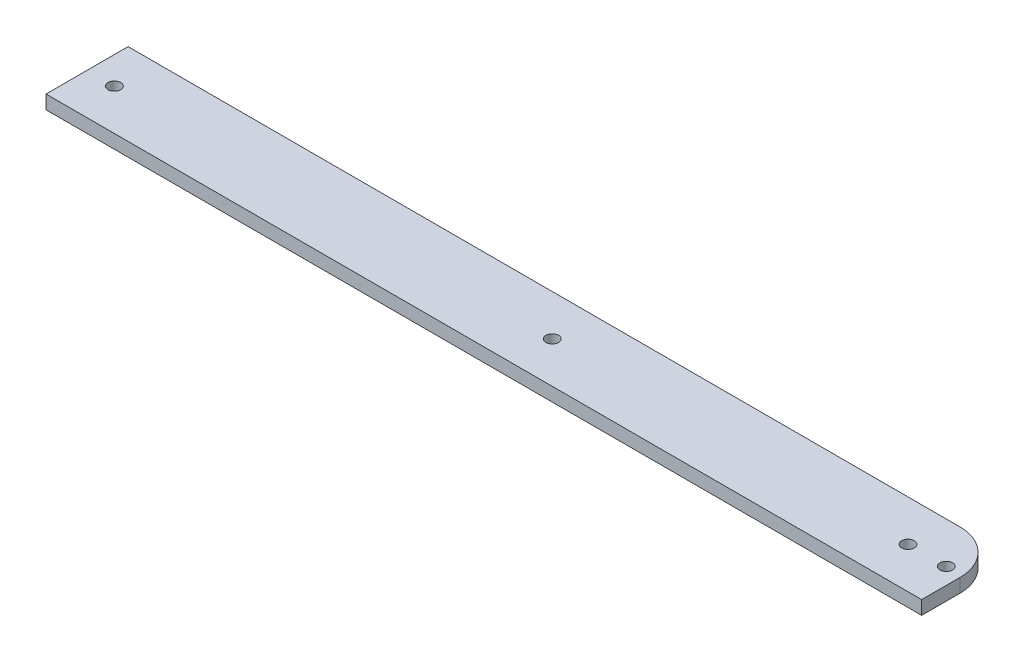
ISO-10303-21;
HEADER;
FILE_DESCRIPTION(('STEP AP214'),'2;1');
FILE_NAME('part.step','',(''),(''),'','','');
FILE_SCHEMA(('AUTOMOTIVE_DESIGN { 1 0 10303 214 1 1 1 1 }'));
ENDSEC;
DATA;
#1=APPLICATION_CONTEXT('core data for automotive mechanical design processes');
#2=APPLICATION_PROTOCOL_DEFINITION('international standard','automotive_design',2000,#1);
#3=PRODUCT_CONTEXT('',#1,'mechanical');
#4=PRODUCT('Part','Part','',(#3));
#5=PRODUCT_RELATED_PRODUCT_CATEGORY('part','',(#4));
#6=PRODUCT_DEFINITION_FORMATION('','',#4);
#7=PRODUCT_DEFINITION_CONTEXT('part definition',#1,'design');
#8=PRODUCT_DEFINITION('design','',#6,#7);
#9=PRODUCT_DEFINITION_SHAPE('','',#8);
#10=(LENGTH_UNIT() NAMED_UNIT(*) SI_UNIT(.MILLI.,.METRE.));
#11=(NAMED_UNIT(*) PLANE_ANGLE_UNIT() SI_UNIT($,.RADIAN.));
#12=(NAMED_UNIT(*) SI_UNIT($,.STERADIAN.) SOLID_ANGLE_UNIT());
#13=UNCERTAINTY_MEASURE_WITH_UNIT(LENGTH_MEASURE(1.E-05),#10,'distance_accuracy_value','');
#14=(GEOMETRIC_REPRESENTATION_CONTEXT(3) GLOBAL_UNCERTAINTY_ASSIGNED_CONTEXT((#13)) GLOBAL_UNIT_ASSIGNED_CONTEXT((#10,
#11,#12)) REPRESENTATION_CONTEXT('',''));
#15=CARTESIAN_POINT('',(0.,0.,0.));
#16=DIRECTION('',(0.,0.,1.));
#17=DIRECTION('',(1.,0.,0.));
#18=AXIS2_PLACEMENT_3D('',#15,#16,#17);
#19=CARTESIAN_POINT('',(0.,3.175,0.));
#20=DIRECTION('',(0.,-1.,0.));
#21=DIRECTION('',(0.,0.,-1.));
#22=AXIS2_PLACEMENT_3D('',#19,#20,#21);
#23=PLANE('',#22);
#24=CARTESIAN_POINT('',(199.39,3.175,-9.525));
#25=DIRECTION('',(0.,-1.,0.));
#26=DIRECTION('',(0.,0.,-1.));
#27=AXIS2_PLACEMENT_3D('',#24,#25,#26);
#28=CIRCLE('',#27,1.4605);
#29=CARTESIAN_POINT('',(199.39,3.175,-10.9855));
#30=VERTEX_POINT('',#29);
#31=EDGE_CURVE('E137',#30,#30,#28,.T.);
#32=ORIENTED_EDGE('',*,*,#31,.T.);
#33=EDGE_LOOP('',(#32));
#34=FACE_BOUND('',#33,.T.);
#35=CARTESIAN_POINT('',(190.5,3.175,-9.525));
#36=DIRECTION('',(0.,-1.,0.));
#37=DIRECTION('',(0.,0.,-1.));
#38=AXIS2_PLACEMENT_3D('',#35,#36,#37);
#39=CIRCLE('',#38,1.4605);
#40=CARTESIAN_POINT('',(190.5,3.175,-10.9855));
#41=VERTEX_POINT('',#40);
#42=EDGE_CURVE('E140',#41,#41,#39,.T.);
#43=ORIENTED_EDGE('',*,*,#42,.T.);
#44=EDGE_LOOP('',(#43));
#45=FACE_BOUND('',#44,.T.);
#46=DIRECTION('',(0.,0.,-1.));
#47=VECTOR('',#46,1.);
#48=CARTESIAN_POINT('',(203.2,3.175,0.));
#49=LINE('',#48,#47);
#50=CARTESIAN_POINT('',(203.2,3.175,0.));
#51=VERTEX_POINT('',#50);
#52=CARTESIAN_POINT('',(203.2,3.175,-8.89));
#53=VERTEX_POINT('',#52);
#54=EDGE_CURVE('E95',#51,#53,#49,.T.);
#55=ORIENTED_EDGE('',*,*,#54,.T.);
#56=CARTESIAN_POINT('',(193.04,3.175,-8.89));
#57=DIRECTION('',(0.,-1.,0.));
#58=DIRECTION('',(0.,0.,-1.));
#59=AXIS2_PLACEMENT_3D('',#56,#57,#58);
#60=CIRCLE('',#59,10.16);
#61=CARTESIAN_POINT('',(193.04,3.175,-19.05));
#62=VERTEX_POINT('',#61);
#63=EDGE_CURVE('E11',#53,#62,#60,.F.);
#64=ORIENTED_EDGE('',*,*,#63,.T.);
#65=DIRECTION('',(-1.,0.,0.));
#66=VECTOR('',#65,1.);
#67=CARTESIAN_POINT('',(0.,3.175,-19.05));
#68=LINE('',#67,#66);
#69=CARTESIAN_POINT('',(0.,3.175,-19.05));
#70=VERTEX_POINT('',#69);
#71=EDGE_CURVE('E101',#62,#70,#68,.T.);
#72=ORIENTED_EDGE('',*,*,#71,.T.);
#73=DIRECTION('',(0.,0.,1.));
#74=VECTOR('',#73,1.);
#75=CARTESIAN_POINT('',(0.,3.175,0.));
#76=LINE('',#75,#74);
#77=CARTESIAN_POINT('',(0.,3.175,0.));
#78=VERTEX_POINT('',#77);
#79=EDGE_CURVE('E96',#70,#78,#76,.T.);
#80=ORIENTED_EDGE('',*,*,#79,.T.);
#81=DIRECTION('',(1.,0.,0.));
#82=VECTOR('',#81,1.);
#83=CARTESIAN_POINT('',(0.,3.175,0.));
#84=LINE('',#83,#82);
#85=EDGE_CURVE('E86',#78,#51,#84,.T.);
#86=ORIENTED_EDGE('',*,*,#85,.T.);
#87=EDGE_LOOP('',(#55,#64,#72,#80,#86));
#88=FACE_BOUND('',#87,.T.);
#89=CARTESIAN_POINT('',(6.35,3.175,-9.525));
#90=DIRECTION('',(0.,1.,0.));
#91=DIRECTION('',(0.,0.,1.));
#92=AXIS2_PLACEMENT_3D('',#89,#90,#91);
#93=CIRCLE('',#92,1.4605);
#94=CARTESIAN_POINT('',(6.35,3.175,-8.0645));
#95=VERTEX_POINT('',#94);
#96=EDGE_CURVE('E125',#95,#95,#93,.T.);
#97=ORIENTED_EDGE('',*,*,#96,.F.);
#98=EDGE_LOOP('',(#97));
#99=FACE_BOUND('',#98,.T.);
#100=CARTESIAN_POINT('',(107.95,3.175,-9.525));
#101=DIRECTION('',(0.,1.,0.));
#102=DIRECTION('',(0.,0.,1.));
#103=AXIS2_PLACEMENT_3D('',#100,#101,#102);
#104=CIRCLE('',#103,1.4605);
#105=CARTESIAN_POINT('',(107.95,3.175,-8.0645));
#106=VERTEX_POINT('',#105);
#107=EDGE_CURVE('E131',#106,#106,#104,.T.);
#108=ORIENTED_EDGE('',*,*,#107,.F.);
#109=EDGE_LOOP('',(#108));
#110=FACE_BOUND('',#109,.T.);
#111=ADVANCED_FACE('F39',(#34,#45,#88,#99,#110),#23,.F.);
#112=CARTESIAN_POINT('',(0.,0.,0.));
#113=DIRECTION('',(0.,-1.,0.));
#114=DIRECTION('',(0.,0.,-1.));
#115=AXIS2_PLACEMENT_3D('',#112,#113,#114);
#116=PLANE('',#115);
#117=CARTESIAN_POINT('',(199.39,0.,-9.525));
#118=DIRECTION('',(0.,-1.,0.));
#119=DIRECTION('',(0.,0.,-1.));
#120=AXIS2_PLACEMENT_3D('',#117,#118,#119);
#121=CIRCLE('',#120,1.4605);
#122=CARTESIAN_POINT('',(199.39,0.,-10.9855));
#123=VERTEX_POINT('',#122);
#124=EDGE_CURVE('E146',#123,#123,#121,.T.);
#125=ORIENTED_EDGE('',*,*,#124,.F.);
#126=EDGE_LOOP('',(#125));
#127=FACE_BOUND('',#126,.T.);
#128=CARTESIAN_POINT('',(190.5,0.,-9.525));
#129=DIRECTION('',(0.,-1.,0.));
#130=DIRECTION('',(0.,0.,-1.));
#131=AXIS2_PLACEMENT_3D('',#128,#129,#130);
#132=CIRCLE('',#131,1.4605);
#133=CARTESIAN_POINT('',(190.5,0.,-10.9855));
#134=VERTEX_POINT('',#133);
#135=EDGE_CURVE('E143',#134,#134,#132,.T.);
#136=ORIENTED_EDGE('',*,*,#135,.F.);
#137=EDGE_LOOP('',(#136));
#138=FACE_BOUND('',#137,.T.);
#139=CARTESIAN_POINT('',(6.35,0.,-9.525));
#140=DIRECTION('',(0.,1.,0.));
#141=DIRECTION('',(0.,0.,1.));
#142=AXIS2_PLACEMENT_3D('',#139,#140,#141);
#143=CIRCLE('',#142,1.4605);
#144=CARTESIAN_POINT('',(6.35,0.,-8.0645));
#145=VERTEX_POINT('',#144);
#146=EDGE_CURVE('E128',#145,#145,#143,.T.);
#147=ORIENTED_EDGE('',*,*,#146,.T.);
#148=EDGE_LOOP('',(#147));
#149=FACE_BOUND('',#148,.T.);
#150=DIRECTION('',(-1.,0.,0.));
#151=VECTOR('',#150,1.);
#152=CARTESIAN_POINT('',(0.,0.,-19.05));
#153=LINE('',#152,#151);
#154=CARTESIAN_POINT('',(193.04,0.,-19.05));
#155=VERTEX_POINT('',#154);
#156=CARTESIAN_POINT('',(0.,0.,-19.05));
#157=VERTEX_POINT('',#156);
#158=EDGE_CURVE('E105',#155,#157,#153,.T.);
#159=ORIENTED_EDGE('',*,*,#158,.F.);
#160=CARTESIAN_POINT('',(193.04,0.,-8.89));
#161=DIRECTION('',(0.,-1.,0.));
#162=DIRECTION('',(0.,0.,-1.));
#163=AXIS2_PLACEMENT_3D('',#160,#161,#162);
#164=CIRCLE('',#163,10.16);
#165=CARTESIAN_POINT('',(203.2,0.,-8.89));
#166=VERTEX_POINT('',#165);
#167=EDGE_CURVE('E61',#155,#166,#164,.T.);
#168=ORIENTED_EDGE('',*,*,#167,.T.);
#169=DIRECTION('',(0.,0.,-1.));
#170=VECTOR('',#169,1.);
#171=CARTESIAN_POINT('',(203.2,0.,0.));
#172=LINE('',#171,#170);
#173=CARTESIAN_POINT('',(203.2,0.,0.));
#174=VERTEX_POINT('',#173);
#175=EDGE_CURVE('E120',#174,#166,#172,.T.);
#176=ORIENTED_EDGE('',*,*,#175,.F.);
#177=DIRECTION('',(1.,0.,0.));
#178=VECTOR('',#177,1.);
#179=CARTESIAN_POINT('',(0.,0.,0.));
#180=LINE('',#179,#178);
#181=CARTESIAN_POINT('',(0.,0.,0.));
#182=VERTEX_POINT('',#181);
#183=EDGE_CURVE('E122',#182,#174,#180,.T.);
#184=ORIENTED_EDGE('',*,*,#183,.F.);
#185=DIRECTION('',(0.,0.,1.));
#186=VECTOR('',#185,1.);
#187=CARTESIAN_POINT('',(0.,0.,0.));
#188=LINE('',#187,#186);
#189=EDGE_CURVE('E109',#157,#182,#188,.T.);
#190=ORIENTED_EDGE('',*,*,#189,.F.);
#191=EDGE_LOOP('',(#159,#168,#176,#184,#190));
#192=FACE_BOUND('',#191,.T.);
#193=CARTESIAN_POINT('',(107.95,0.,-9.525));
#194=DIRECTION('',(0.,1.,0.));
#195=DIRECTION('',(0.,0.,1.));
#196=AXIS2_PLACEMENT_3D('',#193,#194,#195);
#197=CIRCLE('',#196,1.4605);
#198=CARTESIAN_POINT('',(107.95,0.,-8.0645));
#199=VERTEX_POINT('',#198);
#200=EDGE_CURVE('E134',#199,#199,#197,.T.);
#201=ORIENTED_EDGE('',*,*,#200,.T.);
#202=EDGE_LOOP('',(#201));
#203=FACE_BOUND('',#202,.T.);
#204=ADVANCED_FACE('F161',(#127,#138,#149,#192,#203),#116,.T.);
#205=CARTESIAN_POINT('',(0.,3.175,0.));
#206=DIRECTION('',(1.,0.,0.));
#207=DIRECTION('',(0.,0.,-1.));
#208=AXIS2_PLACEMENT_3D('',#205,#206,#207);
#209=PLANE('',#208);
#210=ORIENTED_EDGE('',*,*,#189,.T.);
#211=DIRECTION('',(0.,-1.,0.));
#212=VECTOR('',#211,1.);
#213=CARTESIAN_POINT('',(0.,3.175,0.));
#214=LINE('',#213,#212);
#215=EDGE_CURVE('E90',#78,#182,#214,.T.);
#216=ORIENTED_EDGE('',*,*,#215,.F.);
#217=ORIENTED_EDGE('',*,*,#79,.F.);
#218=DIRECTION('',(0.,-1.,0.));
#219=VECTOR('',#218,1.);
#220=CARTESIAN_POINT('',(0.,3.175,-19.05));
#221=LINE('',#220,#219);
#222=EDGE_CURVE('E114',#70,#157,#221,.T.);
#223=ORIENTED_EDGE('',*,*,#222,.T.);
#224=EDGE_LOOP('',(#210,#216,#217,#223));
#225=FACE_BOUND('',#224,.T.);
#226=ADVANCED_FACE('F107',(#225),#209,.F.);
#227=CARTESIAN_POINT('',(0.,3.175,0.));
#228=DIRECTION('',(0.,0.,-1.));
#229=DIRECTION('',(-1.,0.,0.));
#230=AXIS2_PLACEMENT_3D('',#227,#228,#229);
#231=PLANE('',#230);
#232=ORIENTED_EDGE('',*,*,#183,.T.);
#233=DIRECTION('',(0.,-1.,0.));
#234=VECTOR('',#233,1.);
#235=CARTESIAN_POINT('',(203.2,3.175,0.));
#236=LINE('',#235,#234);
#237=EDGE_CURVE('E93',#51,#174,#236,.T.);
#238=ORIENTED_EDGE('',*,*,#237,.F.);
#239=ORIENTED_EDGE('',*,*,#85,.F.);
#240=ORIENTED_EDGE('',*,*,#215,.T.);
#241=EDGE_LOOP('',(#232,#238,#239,#240));
#242=FACE_BOUND('',#241,.T.);
#243=ADVANCED_FACE('F88',(#242),#231,.F.);
#244=CARTESIAN_POINT('',(203.2,3.175,0.));
#245=DIRECTION('',(-1.,0.,0.));
#246=DIRECTION('',(0.,0.,1.));
#247=AXIS2_PLACEMENT_3D('',#244,#245,#246);
#248=PLANE('',#247);
#249=ORIENTED_EDGE('',*,*,#175,.T.);
#250=DIRECTION('',(0.,-1.,0.));
#251=VECTOR('',#250,1.);
#252=CARTESIAN_POINT('',(203.2,3.175,-8.89));
#253=LINE('',#252,#251);
#254=EDGE_CURVE('E47',#166,#53,#253,.F.);
#255=ORIENTED_EDGE('',*,*,#254,.T.);
#256=ORIENTED_EDGE('',*,*,#54,.F.);
#257=ORIENTED_EDGE('',*,*,#237,.T.);
#258=EDGE_LOOP('',(#249,#255,#256,#257));
#259=FACE_BOUND('',#258,.T.);
#260=ADVANCED_FACE('F192',(#259),#248,.F.);
#261=CARTESIAN_POINT('',(0.,3.175,-19.05));
#262=DIRECTION('',(0.,0.,1.));
#263=DIRECTION('',(1.,0.,0.));
#264=AXIS2_PLACEMENT_3D('',#261,#262,#263);
#265=PLANE('',#264);
#266=ORIENTED_EDGE('',*,*,#71,.F.);
#267=DIRECTION('',(0.,-1.,0.));
#268=VECTOR('',#267,1.);
#269=CARTESIAN_POINT('',(193.04,3.175,-19.05));
#270=LINE('',#269,#268);
#271=EDGE_CURVE('E110',#62,#155,#270,.T.);
#272=ORIENTED_EDGE('',*,*,#271,.T.);
#273=ORIENTED_EDGE('',*,*,#158,.T.);
#274=ORIENTED_EDGE('',*,*,#222,.F.);
#275=EDGE_LOOP('',(#266,#272,#273,#274));
#276=FACE_BOUND('',#275,.T.);
#277=ADVANCED_FACE('F182',(#276),#265,.F.);
#278=CARTESIAN_POINT('',(6.35,3.175,-9.525));
#279=DIRECTION('',(0.,-1.,0.));
#280=DIRECTION('',(0.,0.,-1.));
#281=AXIS2_PLACEMENT_3D('',#278,#279,#280);
#282=CYLINDRICAL_SURFACE('',#281,1.4605);
#283=ORIENTED_EDGE('',*,*,#96,.T.);
#284=EDGE_LOOP('',(#283));
#285=FACE_BOUND('',#284,.T.);
#286=ORIENTED_EDGE('',*,*,#146,.F.);
#287=EDGE_LOOP('',(#286));
#288=FACE_BOUND('',#287,.T.);
#289=ADVANCED_FACE('F173',(#285,#288),#282,.F.);
#290=CARTESIAN_POINT('',(107.95,3.175,-9.525));
#291=DIRECTION('',(0.,-1.,0.));
#292=DIRECTION('',(0.,0.,-1.));
#293=AXIS2_PLACEMENT_3D('',#290,#291,#292);
#294=CYLINDRICAL_SURFACE('',#293,1.4605);
#295=ORIENTED_EDGE('',*,*,#107,.T.);
#296=EDGE_LOOP('',(#295));
#297=FACE_BOUND('',#296,.T.);
#298=ORIENTED_EDGE('',*,*,#200,.F.);
#299=EDGE_LOOP('',(#298));
#300=FACE_BOUND('',#299,.T.);
#301=ADVANCED_FACE('F171',(#297,#300),#294,.F.);
#302=CARTESIAN_POINT('',(190.5,3.175,-9.525));
#303=DIRECTION('',(0.,-1.,0.));
#304=DIRECTION('',(0.,0.,-1.));
#305=AXIS2_PLACEMENT_3D('',#302,#303,#304);
#306=CYLINDRICAL_SURFACE('',#305,1.4605);
#307=ORIENTED_EDGE('',*,*,#42,.F.);
#308=EDGE_LOOP('',(#307));
#309=FACE_BOUND('',#308,.T.);
#310=ORIENTED_EDGE('',*,*,#135,.T.);
#311=EDGE_LOOP('',(#310));
#312=FACE_BOUND('',#311,.T.);
#313=ADVANCED_FACE('F157',(#309,#312),#306,.F.);
#314=CARTESIAN_POINT('',(199.39,3.175,-9.525));
#315=DIRECTION('',(0.,-1.,0.));
#316=DIRECTION('',(0.,0.,-1.));
#317=AXIS2_PLACEMENT_3D('',#314,#315,#316);
#318=CYLINDRICAL_SURFACE('',#317,1.4605);
#319=ORIENTED_EDGE('',*,*,#31,.F.);
#320=EDGE_LOOP('',(#319));
#321=FACE_BOUND('',#320,.T.);
#322=ORIENTED_EDGE('',*,*,#124,.T.);
#323=EDGE_LOOP('',(#322));
#324=FACE_BOUND('',#323,.T.);
#325=ADVANCED_FACE('F154',(#321,#324),#318,.F.);
#326=CARTESIAN_POINT('',(193.04,3.175,-8.89));
#327=DIRECTION('',(0.,-1.,0.));
#328=DIRECTION('',(0.,0.,-1.));
#329=AXIS2_PLACEMENT_3D('',#326,#327,#328);
#330=CYLINDRICAL_SURFACE('',#329,10.16);
#331=ORIENTED_EDGE('',*,*,#63,.F.);
#332=ORIENTED_EDGE('',*,*,#254,.F.);
#333=ORIENTED_EDGE('',*,*,#167,.F.);
#334=ORIENTED_EDGE('',*,*,#271,.F.);
#335=EDGE_LOOP('',(#331,#332,#333,#334));
#336=FACE_BOUND('',#335,.T.);
#337=ADVANCED_FACE('F41',(#336),#330,.T.);
#338=CLOSED_SHELL('',(#111,#204,#226,#243,#260,#277,#289,#301,#313,#325,#337));
#339=MANIFOLD_SOLID_BREP('B2',#338);
#340=ADVANCED_BREP_SHAPE_REPRESENTATION('',(#18,#339),#14);
#341=SHAPE_DEFINITION_REPRESENTATION(#9,#340);
ENDSEC;
END-ISO-10303-21;
